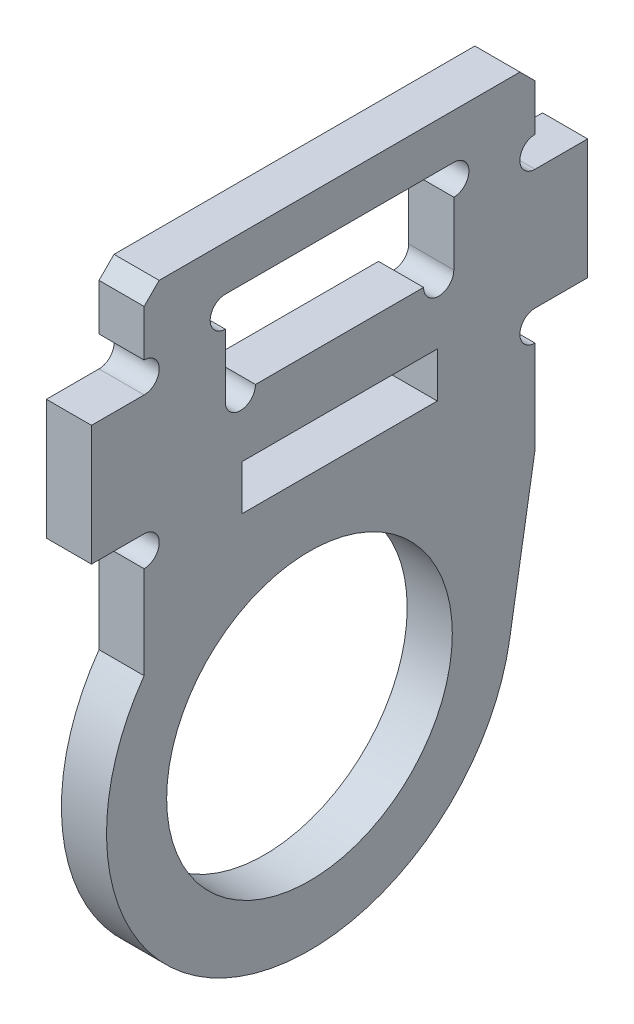
ISO-10303-21;
HEADER;
FILE_DESCRIPTION(('STEP AP214'),'2;1');
FILE_NAME('part.step','',(''),(''),'','','');
FILE_SCHEMA(('AUTOMOTIVE_DESIGN { 1 0 10303 214 1 1 1 1 }'));
ENDSEC;
DATA;
#1=APPLICATION_CONTEXT('core data for automotive mechanical design processes');
#2=APPLICATION_PROTOCOL_DEFINITION('international standard','automotive_design',2000,#1);
#3=PRODUCT_CONTEXT('',#1,'mechanical');
#4=PRODUCT('Part','Part','',(#3));
#5=PRODUCT_RELATED_PRODUCT_CATEGORY('part','',(#4));
#6=PRODUCT_DEFINITION_FORMATION('','',#4);
#7=PRODUCT_DEFINITION_CONTEXT('part definition',#1,'design');
#8=PRODUCT_DEFINITION('design','',#6,#7);
#9=PRODUCT_DEFINITION_SHAPE('','',#8);
#10=(LENGTH_UNIT() NAMED_UNIT(*) SI_UNIT(.MILLI.,.METRE.));
#11=(NAMED_UNIT(*) PLANE_ANGLE_UNIT() SI_UNIT($,.RADIAN.));
#12=(NAMED_UNIT(*) SI_UNIT($,.STERADIAN.) SOLID_ANGLE_UNIT());
#13=UNCERTAINTY_MEASURE_WITH_UNIT(LENGTH_MEASURE(1.E-05),#10,'distance_accuracy_value','');
#14=(GEOMETRIC_REPRESENTATION_CONTEXT(3) GLOBAL_UNCERTAINTY_ASSIGNED_CONTEXT((#13)) GLOBAL_UNIT_ASSIGNED_CONTEXT((#10,
#11,#12)) REPRESENTATION_CONTEXT('',''));
#15=CARTESIAN_POINT('',(0.,0.,0.));
#16=DIRECTION('',(0.,0.,1.));
#17=DIRECTION('',(1.,0.,0.));
#18=AXIS2_PLACEMENT_3D('',#15,#16,#17);
#19=CARTESIAN_POINT('',(3.,0.,13.));
#20=DIRECTION('',(0.,0.,-1.));
#21=DIRECTION('',(-1.,0.,0.));
#22=AXIS2_PLACEMENT_3D('',#19,#20,#21);
#23=PLANE('',#22);
#24=DIRECTION('',(0.,-1.,0.));
#25=VECTOR('',#24,1.);
#26=CARTESIAN_POINT('',(0.,0.,13.));
#27=LINE('',#26,#25);
#28=CARTESIAN_POINT('',(0.,-10.01,13.));
#29=VERTEX_POINT('',#28);
#30=CARTESIAN_POINT('',(0.,-16.1737620787507,13.));
#31=VERTEX_POINT('',#30);
#32=EDGE_CURVE('E424',#29,#31,#27,.T.);
#33=ORIENTED_EDGE('',*,*,#32,.T.);
#34=DIRECTION('',(-1.,0.,0.));
#35=VECTOR('',#34,1.);
#36=CARTESIAN_POINT('',(3.,-16.1737620787507,13.));
#37=LINE('',#36,#35);
#38=CARTESIAN_POINT('',(3.,-16.1737620787507,13.));
#39=VERTEX_POINT('',#38);
#40=EDGE_CURVE('E279',#39,#31,#37,.T.);
#41=ORIENTED_EDGE('',*,*,#40,.F.);
#42=DIRECTION('',(0.,-1.,0.));
#43=VECTOR('',#42,1.);
#44=CARTESIAN_POINT('',(3.,0.,13.));
#45=LINE('',#44,#43);
#46=CARTESIAN_POINT('',(3.,-10.01,13.));
#47=VERTEX_POINT('',#46);
#48=EDGE_CURVE('E489',#47,#39,#45,.T.);
#49=ORIENTED_EDGE('',*,*,#48,.F.);
#50=DIRECTION('',(-1.,0.,0.));
#51=VECTOR('',#50,1.);
#52=CARTESIAN_POINT('',(3.,-10.01,13.));
#53=LINE('',#52,#51);
#54=EDGE_CURVE('E333',#47,#29,#53,.T.);
#55=ORIENTED_EDGE('',*,*,#54,.T.);
#56=EDGE_LOOP('',(#33,#41,#49,#55));
#57=FACE_BOUND('',#56,.T.);
#58=ADVANCED_FACE('F37',(#57),#23,.F.);
#59=CARTESIAN_POINT('',(3.,-24.,2.));
#60=DIRECTION('',(-1.,0.,0.));
#61=DIRECTION('',(0.,0.,1.));
#62=AXIS2_PLACEMENT_3D('',#59,#60,#61);
#63=CYLINDRICAL_SURFACE('',#62,13.5);
#64=CARTESIAN_POINT('',(0.,-24.,2.));
#65=DIRECTION('',(1.,0.,0.));
#66=DIRECTION('',(0.,0.,-1.));
#67=AXIS2_PLACEMENT_3D('',#64,#65,#66);
#68=CIRCLE('',#67,13.5);
#69=CARTESIAN_POINT('',(0.,-26.2315145567071,-11.3142909230347));
#70=VERTEX_POINT('',#69);
#71=EDGE_CURVE('E427',#31,#70,#68,.T.);
#72=ORIENTED_EDGE('',*,*,#71,.T.);
#73=DIRECTION('',(-1.,0.,0.));
#74=VECTOR('',#73,1.);
#75=CARTESIAN_POINT('',(3.,-26.2315145567071,-11.3142909230347));
#76=LINE('',#75,#74);
#77=CARTESIAN_POINT('',(3.,-26.2315145567071,-11.3142909230347));
#78=VERTEX_POINT('',#77);
#79=EDGE_CURVE('E362',#78,#70,#76,.T.);
#80=ORIENTED_EDGE('',*,*,#79,.F.);
#81=CARTESIAN_POINT('',(3.,-24.,2.));
#82=DIRECTION('',(1.,0.,0.));
#83=DIRECTION('',(0.,0.,-1.));
#84=AXIS2_PLACEMENT_3D('',#81,#82,#83);
#85=CIRCLE('',#84,13.5);
#86=EDGE_CURVE('E485',#39,#78,#85,.T.);
#87=ORIENTED_EDGE('',*,*,#86,.F.);
#88=ORIENTED_EDGE('',*,*,#40,.T.);
#89=EDGE_LOOP('',(#72,#80,#87,#88));
#90=FACE_BOUND('',#89,.T.);
#91=ADVANCED_FACE('F484',(#90),#63,.T.);
#92=CARTESIAN_POINT('',(3.,-2.56122487324548,-15.2815015161827));
#93=DIRECTION('',(0.,-0.165297374570894,-0.986243772076645));
#94=DIRECTION('',(0.,0.986243772076645,-0.165297374570894));
#95=AXIS2_PLACEMENT_3D('',#92,#93,#94);
#96=PLANE('',#95);
#97=DIRECTION('',(0.,-0.986243772076645,0.165297374570894));
#98=VECTOR('',#97,1.);
#99=CARTESIAN_POINT('',(0.,-2.56122487324548,-15.2815015161827));
#100=LINE('',#99,#98);
#101=CARTESIAN_POINT('',(0.,-16.1737620787507,-13.));
#102=VERTEX_POINT('',#101);
#103=EDGE_CURVE('E430',#102,#70,#100,.T.);
#104=ORIENTED_EDGE('',*,*,#103,.F.);
#105=DIRECTION('',(-1.,0.,0.));
#106=VECTOR('',#105,1.);
#107=CARTESIAN_POINT('',(3.,-16.1737620787507,-13.));
#108=LINE('',#107,#106);
#109=CARTESIAN_POINT('',(3.,-16.1737620787507,-13.));
#110=VERTEX_POINT('',#109);
#111=EDGE_CURVE('E360',#110,#102,#108,.T.);
#112=ORIENTED_EDGE('',*,*,#111,.F.);
#113=DIRECTION('',(0.,-0.986243772076645,0.165297374570894));
#114=VECTOR('',#113,1.);
#115=CARTESIAN_POINT('',(3.,-2.56122487324548,-15.2815015161827));
#116=LINE('',#115,#114);
#117=EDGE_CURVE('E829',#110,#78,#116,.T.);
#118=ORIENTED_EDGE('',*,*,#117,.T.);
#119=ORIENTED_EDGE('',*,*,#79,.T.);
#120=EDGE_LOOP('',(#104,#112,#118,#119));
#121=FACE_BOUND('',#120,.T.);
#122=ADVANCED_FACE('F478',(#121),#96,.T.);
#123=CARTESIAN_POINT('',(3.,0.,-13.));
#124=DIRECTION('',(0.,0.,-1.));
#125=DIRECTION('',(-1.,0.,0.));
#126=AXIS2_PLACEMENT_3D('',#123,#124,#125);
#127=PLANE('',#126);
#128=DIRECTION('',(0.,-1.,0.));
#129=VECTOR('',#128,1.);
#130=CARTESIAN_POINT('',(0.,0.,-13.));
#131=LINE('',#130,#129);
#132=CARTESIAN_POINT('',(0.,-10.01,-13.));
#133=VERTEX_POINT('',#132);
#134=EDGE_CURVE('E433',#133,#102,#131,.T.);
#135=ORIENTED_EDGE('',*,*,#134,.F.);
#136=DIRECTION('',(-1.,0.,0.));
#137=VECTOR('',#136,1.);
#138=CARTESIAN_POINT('',(3.,-10.01,-13.));
#139=LINE('',#138,#137);
#140=CARTESIAN_POINT('',(3.,-10.01,-13.));
#141=VERTEX_POINT('',#140);
#142=EDGE_CURVE('E358',#141,#133,#139,.T.);
#143=ORIENTED_EDGE('',*,*,#142,.F.);
#144=DIRECTION('',(0.,-1.,0.));
#145=VECTOR('',#144,1.);
#146=CARTESIAN_POINT('',(3.,0.,-13.));
#147=LINE('',#146,#145);
#148=EDGE_CURVE('E474',#141,#110,#147,.T.);
#149=ORIENTED_EDGE('',*,*,#148,.T.);
#150=ORIENTED_EDGE('',*,*,#111,.T.);
#151=EDGE_LOOP('',(#135,#143,#149,#150));
#152=FACE_BOUND('',#151,.T.);
#153=ADVANCED_FACE('F472',(#152),#127,.T.);
#154=CARTESIAN_POINT('',(3.,-9.005,-13.));
#155=DIRECTION('',(-1.,0.,0.));
#156=DIRECTION('',(0.,0.,1.));
#157=AXIS2_PLACEMENT_3D('',#154,#155,#156);
#158=CYLINDRICAL_SURFACE('',#157,1.005);
#159=CARTESIAN_POINT('',(0.,-9.005,-13.));
#160=DIRECTION('',(1.,0.,0.));
#161=DIRECTION('',(0.,0.,-1.));
#162=AXIS2_PLACEMENT_3D('',#159,#160,#161);
#163=CIRCLE('',#162,1.005);
#164=CARTESIAN_POINT('',(0.,-8.,-13.));
#165=VERTEX_POINT('',#164);
#166=EDGE_CURVE('E436',#165,#133,#163,.T.);
#167=ORIENTED_EDGE('',*,*,#166,.F.);
#168=DIRECTION('',(-1.,0.,0.));
#169=VECTOR('',#168,1.);
#170=CARTESIAN_POINT('',(3.,-8.,-13.));
#171=LINE('',#170,#169);
#172=CARTESIAN_POINT('',(3.,-8.,-13.));
#173=VERTEX_POINT('',#172);
#174=EDGE_CURVE('E356',#173,#165,#171,.T.);
#175=ORIENTED_EDGE('',*,*,#174,.F.);
#176=CARTESIAN_POINT('',(3.,-9.005,-13.));
#177=DIRECTION('',(1.,0.,0.));
#178=DIRECTION('',(0.,0.,-1.));
#179=AXIS2_PLACEMENT_3D('',#176,#177,#178);
#180=CIRCLE('',#179,1.005);
#181=EDGE_CURVE('E468',#173,#141,#180,.T.);
#182=ORIENTED_EDGE('',*,*,#181,.T.);
#183=ORIENTED_EDGE('',*,*,#142,.T.);
#184=EDGE_LOOP('',(#167,#175,#182,#183));
#185=FACE_BOUND('',#184,.T.);
#186=ADVANCED_FACE('F465',(#185),#158,.F.);
#187=CARTESIAN_POINT('',(3.,-8.00000000000001,0.));
#188=DIRECTION('',(0.,-1.,0.));
#189=DIRECTION('',(0.,0.,-1.));
#190=AXIS2_PLACEMENT_3D('',#187,#188,#189);
#191=PLANE('',#190);
#192=DIRECTION('',(0.,0.,1.));
#193=VECTOR('',#192,1.);
#194=CARTESIAN_POINT('',(0.,-8.00000000000001,0.));
#195=LINE('',#194,#193);
#196=CARTESIAN_POINT('',(0.,-8.,-16.5));
#197=VERTEX_POINT('',#196);
#198=EDGE_CURVE('E439',#197,#165,#195,.T.);
#199=ORIENTED_EDGE('',*,*,#198,.F.);
#200=DIRECTION('',(-1.,0.,0.));
#201=VECTOR('',#200,1.);
#202=CARTESIAN_POINT('',(3.,-8.,-16.5));
#203=LINE('',#202,#201);
#204=CARTESIAN_POINT('',(3.,-8.,-16.5));
#205=VERTEX_POINT('',#204);
#206=EDGE_CURVE('E354',#205,#197,#203,.T.);
#207=ORIENTED_EDGE('',*,*,#206,.F.);
#208=DIRECTION('',(0.,0.,1.));
#209=VECTOR('',#208,1.);
#210=CARTESIAN_POINT('',(3.,-8.00000000000001,0.));
#211=LINE('',#210,#209);
#212=EDGE_CURVE('E838',#205,#173,#211,.T.);
#213=ORIENTED_EDGE('',*,*,#212,.T.);
#214=ORIENTED_EDGE('',*,*,#174,.T.);
#215=EDGE_LOOP('',(#199,#207,#213,#214));
#216=FACE_BOUND('',#215,.T.);
#217=ADVANCED_FACE('F461',(#216),#191,.T.);
#218=CARTESIAN_POINT('',(3.,0.,-16.5));
#219=DIRECTION('',(0.,0.,-1.));
#220=DIRECTION('',(-1.,0.,0.));
#221=AXIS2_PLACEMENT_3D('',#218,#219,#220);
#222=PLANE('',#221);
#223=DIRECTION('',(0.,-1.,0.));
#224=VECTOR('',#223,1.);
#225=CARTESIAN_POINT('',(0.,0.,-16.5));
#226=LINE('',#225,#224);
#227=CARTESIAN_POINT('',(0.,0.,-16.5));
#228=VERTEX_POINT('',#227);
#229=EDGE_CURVE('E442',#228,#197,#226,.T.);
#230=ORIENTED_EDGE('',*,*,#229,.F.);
#231=DIRECTION('',(-1.,0.,0.));
#232=VECTOR('',#231,1.);
#233=CARTESIAN_POINT('',(3.,0.,-16.5));
#234=LINE('',#233,#232);
#235=CARTESIAN_POINT('',(3.,0.,-16.5));
#236=VERTEX_POINT('',#235);
#237=EDGE_CURVE('E352',#236,#228,#234,.T.);
#238=ORIENTED_EDGE('',*,*,#237,.F.);
#239=DIRECTION('',(0.,-1.,0.));
#240=VECTOR('',#239,1.);
#241=CARTESIAN_POINT('',(3.,0.,-16.5));
#242=LINE('',#241,#240);
#243=EDGE_CURVE('E457',#236,#205,#242,.T.);
#244=ORIENTED_EDGE('',*,*,#243,.T.);
#245=ORIENTED_EDGE('',*,*,#206,.T.);
#246=EDGE_LOOP('',(#230,#238,#244,#245));
#247=FACE_BOUND('',#246,.T.);
#248=ADVANCED_FACE('F455',(#247),#222,.T.);
#249=CARTESIAN_POINT('',(3.,0.,0.));
#250=DIRECTION('',(0.,1.,0.));
#251=DIRECTION('',(0.,0.,1.));
#252=AXIS2_PLACEMENT_3D('',#249,#250,#251);
#253=PLANE('',#252);
#254=DIRECTION('',(0.,0.,-1.));
#255=VECTOR('',#254,1.);
#256=CARTESIAN_POINT('',(0.,0.,0.));
#257=LINE('',#256,#255);
#258=CARTESIAN_POINT('',(0.,0.,-13.));
#259=VERTEX_POINT('',#258);
#260=EDGE_CURVE('E316',#259,#228,#257,.T.);
#261=ORIENTED_EDGE('',*,*,#260,.F.);
#262=DIRECTION('',(-1.,0.,0.));
#263=VECTOR('',#262,1.);
#264=CARTESIAN_POINT('',(3.,0.,-13.));
#265=LINE('',#264,#263);
#266=CARTESIAN_POINT('',(3.,0.,-13.));
#267=VERTEX_POINT('',#266);
#268=EDGE_CURVE('E350',#267,#259,#265,.T.);
#269=ORIENTED_EDGE('',*,*,#268,.F.);
#270=DIRECTION('',(0.,0.,-1.));
#271=VECTOR('',#270,1.);
#272=CARTESIAN_POINT('',(3.,0.,0.));
#273=LINE('',#272,#271);
#274=EDGE_CURVE('E451',#267,#236,#273,.T.);
#275=ORIENTED_EDGE('',*,*,#274,.T.);
#276=ORIENTED_EDGE('',*,*,#237,.T.);
#277=EDGE_LOOP('',(#261,#269,#275,#276));
#278=FACE_BOUND('',#277,.T.);
#279=ADVANCED_FACE('F448',(#278),#253,.T.);
#280=CARTESIAN_POINT('',(3.,1.005,-13.));
#281=DIRECTION('',(-1.,0.,0.));
#282=DIRECTION('',(0.,0.,1.));
#283=AXIS2_PLACEMENT_3D('',#280,#281,#282);
#284=CYLINDRICAL_SURFACE('',#283,1.005);
#285=CARTESIAN_POINT('',(0.,1.005,-13.));
#286=DIRECTION('',(1.,0.,0.));
#287=DIRECTION('',(0.,0.,-1.));
#288=AXIS2_PLACEMENT_3D('',#285,#286,#287);
#289=CIRCLE('',#288,1.005);
#290=CARTESIAN_POINT('',(0.,2.01,-13.));
#291=VERTEX_POINT('',#290);
#292=EDGE_CURVE('E312',#291,#259,#289,.T.);
#293=ORIENTED_EDGE('',*,*,#292,.F.);
#294=DIRECTION('',(-1.,0.,0.));
#295=VECTOR('',#294,1.);
#296=CARTESIAN_POINT('',(3.,2.01,-13.));
#297=LINE('',#296,#295);
#298=CARTESIAN_POINT('',(3.,2.01,-13.));
#299=VERTEX_POINT('',#298);
#300=EDGE_CURVE('E310',#299,#291,#297,.T.);
#301=ORIENTED_EDGE('',*,*,#300,.F.);
#302=CARTESIAN_POINT('',(3.,1.005,-13.));
#303=DIRECTION('',(1.,0.,0.));
#304=DIRECTION('',(0.,0.,-1.));
#305=AXIS2_PLACEMENT_3D('',#302,#303,#304);
#306=CIRCLE('',#305,1.005);
#307=EDGE_CURVE('E815',#299,#267,#306,.T.);
#308=ORIENTED_EDGE('',*,*,#307,.T.);
#309=ORIENTED_EDGE('',*,*,#268,.T.);
#310=EDGE_LOOP('',(#293,#301,#308,#309));
#311=FACE_BOUND('',#310,.T.);
#312=ADVANCED_FACE('F734',(#311),#284,.F.);
#313=CARTESIAN_POINT('',(3.,0.,-13.));
#314=DIRECTION('',(0.,0.,-1.));
#315=DIRECTION('',(-1.,0.,0.));
#316=AXIS2_PLACEMENT_3D('',#313,#314,#315);
#317=PLANE('',#316);
#318=DIRECTION('',(0.,-1.,0.));
#319=VECTOR('',#318,1.);
#320=CARTESIAN_POINT('',(0.,0.,-13.));
#321=LINE('',#320,#319);
#322=CARTESIAN_POINT('',(0.,5.1,-13.));
#323=VERTEX_POINT('',#322);
#324=EDGE_CURVE('E305',#323,#291,#321,.T.);
#325=ORIENTED_EDGE('',*,*,#324,.F.);
#326=DIRECTION('',(1.,0.,0.));
#327=VECTOR('',#326,1.);
#328=CARTESIAN_POINT('',(3.,5.1,-13.));
#329=LINE('',#328,#327);
#330=CARTESIAN_POINT('',(3.,5.1,-13.));
#331=VERTEX_POINT('',#330);
#332=EDGE_CURVE('E60',#323,#331,#329,.T.);
#333=ORIENTED_EDGE('',*,*,#332,.T.);
#334=DIRECTION('',(0.,-1.,0.));
#335=VECTOR('',#334,1.);
#336=CARTESIAN_POINT('',(3.,0.,-13.));
#337=LINE('',#336,#335);
#338=EDGE_CURVE('E291',#331,#299,#337,.T.);
#339=ORIENTED_EDGE('',*,*,#338,.T.);
#340=ORIENTED_EDGE('',*,*,#300,.T.);
#341=EDGE_LOOP('',(#325,#333,#339,#340));
#342=FACE_BOUND('',#341,.T.);
#343=ADVANCED_FACE('F308',(#342),#317,.T.);
#344=CARTESIAN_POINT('',(3.,6.1,0.));
#345=DIRECTION('',(0.,1.,0.));
#346=DIRECTION('',(0.,0.,1.));
#347=AXIS2_PLACEMENT_3D('',#344,#345,#346);
#348=PLANE('',#347);
#349=DIRECTION('',(0.,0.,-1.));
#350=VECTOR('',#349,1.);
#351=CARTESIAN_POINT('',(3.,6.1,0.));
#352=LINE('',#351,#350);
#353=CARTESIAN_POINT('',(3.,6.1,12.));
#354=VERTEX_POINT('',#353);
#355=CARTESIAN_POINT('',(3.,6.1,-12.));
#356=VERTEX_POINT('',#355);
#357=EDGE_CURVE('E289',#354,#356,#352,.T.);
#358=ORIENTED_EDGE('',*,*,#357,.T.);
#359=DIRECTION('',(-1.,0.,0.));
#360=VECTOR('',#359,1.);
#361=CARTESIAN_POINT('',(3.,6.1,-12.));
#362=LINE('',#361,#360);
#363=CARTESIAN_POINT('',(0.,6.1,-12.));
#364=VERTEX_POINT('',#363);
#365=EDGE_CURVE('E278',#356,#364,#362,.T.);
#366=ORIENTED_EDGE('',*,*,#365,.T.);
#367=DIRECTION('',(0.,0.,-1.));
#368=VECTOR('',#367,1.);
#369=CARTESIAN_POINT('',(0.,6.1,0.));
#370=LINE('',#369,#368);
#371=CARTESIAN_POINT('',(0.,6.1,12.));
#372=VERTEX_POINT('',#371);
#373=EDGE_CURVE('E307',#372,#364,#370,.T.);
#374=ORIENTED_EDGE('',*,*,#373,.F.);
#375=DIRECTION('',(1.,0.,0.));
#376=VECTOR('',#375,1.);
#377=CARTESIAN_POINT('',(3.,6.1,12.));
#378=LINE('',#377,#376);
#379=EDGE_CURVE('E276',#372,#354,#378,.T.);
#380=ORIENTED_EDGE('',*,*,#379,.T.);
#381=EDGE_LOOP('',(#358,#366,#374,#380));
#382=FACE_BOUND('',#381,.T.);
#383=ADVANCED_FACE('F295',(#382),#348,.T.);
#384=CARTESIAN_POINT('',(3.,0.,13.));
#385=DIRECTION('',(0.,0.,-1.));
#386=DIRECTION('',(-1.,0.,0.));
#387=AXIS2_PLACEMENT_3D('',#384,#385,#386);
#388=PLANE('',#387);
#389=DIRECTION('',(0.,-1.,0.));
#390=VECTOR('',#389,1.);
#391=CARTESIAN_POINT('',(3.,0.,13.));
#392=LINE('',#391,#390);
#393=CARTESIAN_POINT('',(3.,5.1,13.));
#394=VERTEX_POINT('',#393);
#395=CARTESIAN_POINT('',(3.,2.01,13.));
#396=VERTEX_POINT('',#395);
#397=EDGE_CURVE('E299',#394,#396,#392,.T.);
#398=ORIENTED_EDGE('',*,*,#397,.F.);
#399=DIRECTION('',(-1.,0.,0.));
#400=VECTOR('',#399,1.);
#401=CARTESIAN_POINT('',(0.,5.1,13.));
#402=LINE('',#401,#400);
#403=CARTESIAN_POINT('',(0.,5.1,13.));
#404=VERTEX_POINT('',#403);
#405=EDGE_CURVE('E11',#394,#404,#402,.T.);
#406=ORIENTED_EDGE('',*,*,#405,.T.);
#407=DIRECTION('',(0.,-1.,0.));
#408=VECTOR('',#407,1.);
#409=CARTESIAN_POINT('',(0.,0.,13.));
#410=LINE('',#409,#408);
#411=CARTESIAN_POINT('',(0.,2.01,13.));
#412=VERTEX_POINT('',#411);
#413=EDGE_CURVE('E314',#404,#412,#410,.T.);
#414=ORIENTED_EDGE('',*,*,#413,.T.);
#415=DIRECTION('',(-1.,0.,0.));
#416=VECTOR('',#415,1.);
#417=CARTESIAN_POINT('',(3.,2.01,13.));
#418=LINE('',#417,#416);
#419=EDGE_CURVE('E346',#396,#412,#418,.T.);
#420=ORIENTED_EDGE('',*,*,#419,.F.);
#421=EDGE_LOOP('',(#398,#406,#414,#420));
#422=FACE_BOUND('',#421,.T.);
#423=ADVANCED_FACE('F521',(#422),#388,.F.);
#424=CARTESIAN_POINT('',(3.,1.005,13.));
#425=DIRECTION('',(-1.,0.,0.));
#426=DIRECTION('',(0.,0.,1.));
#427=AXIS2_PLACEMENT_3D('',#424,#425,#426);
#428=CYLINDRICAL_SURFACE('',#427,1.005);
#429=CARTESIAN_POINT('',(0.,1.005,13.));
#430=DIRECTION('',(1.,0.,0.));
#431=DIRECTION('',(0.,0.,-1.));
#432=AXIS2_PLACEMENT_3D('',#429,#430,#431);
#433=CIRCLE('',#432,1.005);
#434=CARTESIAN_POINT('',(0.,0.,13.));
#435=VERTEX_POINT('',#434);
#436=EDGE_CURVE('E321',#435,#412,#433,.T.);
#437=ORIENTED_EDGE('',*,*,#436,.F.);
#438=DIRECTION('',(-1.,0.,0.));
#439=VECTOR('',#438,1.);
#440=CARTESIAN_POINT('',(3.,0.,13.));
#441=LINE('',#440,#439);
#442=CARTESIAN_POINT('',(3.,0.,13.));
#443=VERTEX_POINT('',#442);
#444=EDGE_CURVE('E344',#443,#435,#441,.T.);
#445=ORIENTED_EDGE('',*,*,#444,.F.);
#446=CARTESIAN_POINT('',(3.,1.005,13.));
#447=DIRECTION('',(1.,0.,0.));
#448=DIRECTION('',(0.,0.,-1.));
#449=AXIS2_PLACEMENT_3D('',#446,#447,#448);
#450=CIRCLE('',#449,1.005);
#451=EDGE_CURVE('E519',#443,#396,#450,.T.);
#452=ORIENTED_EDGE('',*,*,#451,.T.);
#453=ORIENTED_EDGE('',*,*,#419,.T.);
#454=EDGE_LOOP('',(#437,#445,#452,#453));
#455=FACE_BOUND('',#454,.T.);
#456=ADVANCED_FACE('F516',(#455),#428,.F.);
#457=CARTESIAN_POINT('',(3.,0.,0.));
#458=DIRECTION('',(0.,-1.,0.));
#459=DIRECTION('',(0.,0.,-1.));
#460=AXIS2_PLACEMENT_3D('',#457,#458,#459);
#461=PLANE('',#460);
#462=DIRECTION('',(0.,0.,1.));
#463=VECTOR('',#462,1.);
#464=CARTESIAN_POINT('',(0.,0.,0.));
#465=LINE('',#464,#463);
#466=CARTESIAN_POINT('',(0.,0.,16.5));
#467=VERTEX_POINT('',#466);
#468=EDGE_CURVE('E324',#435,#467,#465,.T.);
#469=ORIENTED_EDGE('',*,*,#468,.T.);
#470=DIRECTION('',(-1.,0.,0.));
#471=VECTOR('',#470,1.);
#472=CARTESIAN_POINT('',(3.,0.,16.5));
#473=LINE('',#472,#471);
#474=CARTESIAN_POINT('',(3.,0.,16.5));
#475=VERTEX_POINT('',#474);
#476=EDGE_CURVE('E341',#475,#467,#473,.T.);
#477=ORIENTED_EDGE('',*,*,#476,.F.);
#478=DIRECTION('',(0.,0.,1.));
#479=VECTOR('',#478,1.);
#480=CARTESIAN_POINT('',(3.,0.,0.));
#481=LINE('',#480,#479);
#482=EDGE_CURVE('E511',#443,#475,#481,.T.);
#483=ORIENTED_EDGE('',*,*,#482,.F.);
#484=ORIENTED_EDGE('',*,*,#444,.T.);
#485=EDGE_LOOP('',(#469,#477,#483,#484));
#486=FACE_BOUND('',#485,.T.);
#487=ADVANCED_FACE('F510',(#486),#461,.F.);
#488=CARTESIAN_POINT('',(3.,0.,16.5));
#489=DIRECTION('',(0.,0.,-1.));
#490=DIRECTION('',(-1.,0.,0.));
#491=AXIS2_PLACEMENT_3D('',#488,#489,#490);
#492=PLANE('',#491);
#493=DIRECTION('',(0.,-1.,0.));
#494=VECTOR('',#493,1.);
#495=CARTESIAN_POINT('',(0.,0.,16.5));
#496=LINE('',#495,#494);
#497=CARTESIAN_POINT('',(0.,-8.,16.5));
#498=VERTEX_POINT('',#497);
#499=EDGE_CURVE('E326',#467,#498,#496,.T.);
#500=ORIENTED_EDGE('',*,*,#499,.T.);
#501=DIRECTION('',(-1.,0.,0.));
#502=VECTOR('',#501,1.);
#503=CARTESIAN_POINT('',(3.,-8.,16.5));
#504=LINE('',#503,#502);
#505=CARTESIAN_POINT('',(3.,-8.,16.5));
#506=VERTEX_POINT('',#505);
#507=EDGE_CURVE('E338',#506,#498,#504,.T.);
#508=ORIENTED_EDGE('',*,*,#507,.F.);
#509=DIRECTION('',(0.,-1.,0.));
#510=VECTOR('',#509,1.);
#511=CARTESIAN_POINT('',(3.,0.,16.5));
#512=LINE('',#511,#510);
#513=EDGE_CURVE('E506',#475,#506,#512,.T.);
#514=ORIENTED_EDGE('',*,*,#513,.F.);
#515=ORIENTED_EDGE('',*,*,#476,.T.);
#516=EDGE_LOOP('',(#500,#508,#514,#515));
#517=FACE_BOUND('',#516,.T.);
#518=ADVANCED_FACE('F505',(#517),#492,.F.);
#519=CARTESIAN_POINT('',(3.,-8.00000000000002,0.));
#520=DIRECTION('',(0.,1.,0.));
#521=DIRECTION('',(0.,0.,1.));
#522=AXIS2_PLACEMENT_3D('',#519,#520,#521);
#523=PLANE('',#522);
#524=DIRECTION('',(0.,0.,-1.));
#525=VECTOR('',#524,1.);
#526=CARTESIAN_POINT('',(0.,-8.00000000000002,0.));
#527=LINE('',#526,#525);
#528=CARTESIAN_POINT('',(0.,-8.00000000000001,13.));
#529=VERTEX_POINT('',#528);
#530=EDGE_CURVE('E328',#498,#529,#527,.T.);
#531=ORIENTED_EDGE('',*,*,#530,.T.);
#532=DIRECTION('',(-1.,0.,0.));
#533=VECTOR('',#532,1.);
#534=CARTESIAN_POINT('',(3.,-8.00000000000001,13.));
#535=LINE('',#534,#533);
#536=CARTESIAN_POINT('',(3.,-8.00000000000001,13.));
#537=VERTEX_POINT('',#536);
#538=EDGE_CURVE('E335',#537,#529,#535,.T.);
#539=ORIENTED_EDGE('',*,*,#538,.F.);
#540=DIRECTION('',(0.,0.,-1.));
#541=VECTOR('',#540,1.);
#542=CARTESIAN_POINT('',(3.,-8.00000000000002,0.));
#543=LINE('',#542,#541);
#544=EDGE_CURVE('E502',#506,#537,#543,.T.);
#545=ORIENTED_EDGE('',*,*,#544,.F.);
#546=ORIENTED_EDGE('',*,*,#507,.T.);
#547=EDGE_LOOP('',(#531,#539,#545,#546));
#548=FACE_BOUND('',#547,.T.);
#549=ADVANCED_FACE('F499',(#548),#523,.F.);
#550=CARTESIAN_POINT('',(3.,2.095,7.6));
#551=DIRECTION('',(-1.,0.,0.));
#552=DIRECTION('',(0.,0.,1.));
#553=AXIS2_PLACEMENT_3D('',#550,#551,#552);
#554=CYLINDRICAL_SURFACE('',#553,1.005);
#555=CARTESIAN_POINT('',(0.,2.095,7.6));
#556=DIRECTION('',(1.,0.,0.));
#557=DIRECTION('',(0.,0.,-1.));
#558=AXIS2_PLACEMENT_3D('',#555,#556,#557);
#559=CIRCLE('',#558,1.005);
#560=CARTESIAN_POINT('',(0.,3.1,7.6));
#561=VERTEX_POINT('',#560);
#562=CARTESIAN_POINT('',(0.,1.09,7.6));
#563=VERTEX_POINT('',#562);
#564=EDGE_CURVE('E397',#561,#563,#559,.T.);
#565=ORIENTED_EDGE('',*,*,#564,.F.);
#566=DIRECTION('',(-1.,0.,0.));
#567=VECTOR('',#566,1.);
#568=CARTESIAN_POINT('',(3.,3.1,7.6));
#569=LINE('',#568,#567);
#570=CARTESIAN_POINT('',(3.,3.1,7.6));
#571=VERTEX_POINT('',#570);
#572=EDGE_CURVE('E336',#571,#561,#569,.T.);
#573=ORIENTED_EDGE('',*,*,#572,.F.);
#574=CARTESIAN_POINT('',(3.,2.095,7.6));
#575=DIRECTION('',(1.,0.,0.));
#576=DIRECTION('',(0.,0.,-1.));
#577=AXIS2_PLACEMENT_3D('',#574,#575,#576);
#578=CIRCLE('',#577,1.005);
#579=CARTESIAN_POINT('',(3.,1.09,7.6));
#580=VERTEX_POINT('',#579);
#581=EDGE_CURVE('E855',#571,#580,#578,.T.);
#582=ORIENTED_EDGE('',*,*,#581,.T.);
#583=DIRECTION('',(-1.,0.,0.));
#584=VECTOR('',#583,1.);
#585=CARTESIAN_POINT('',(3.,1.09,7.6));
#586=LINE('',#585,#584);
#587=EDGE_CURVE('E268',#580,#563,#586,.T.);
#588=ORIENTED_EDGE('',*,*,#587,.T.);
#589=EDGE_LOOP('',(#565,#573,#582,#588));
#590=FACE_BOUND('',#589,.T.);
#591=ADVANCED_FACE('F564',(#590),#554,.F.);
#592=CARTESIAN_POINT('',(3.,3.1,0.));
#593=DIRECTION('',(0.,-1.,0.));
#594=DIRECTION('',(0.,0.,-1.));
#595=AXIS2_PLACEMENT_3D('',#592,#593,#594);
#596=PLANE('',#595);
#597=DIRECTION('',(0.,0.,1.));
#598=VECTOR('',#597,1.);
#599=CARTESIAN_POINT('',(0.,3.1,0.));
#600=LINE('',#599,#598);
#601=CARTESIAN_POINT('',(0.,3.1,-7.6));
#602=VERTEX_POINT('',#601);
#603=EDGE_CURVE('E403',#602,#561,#600,.T.);
#604=ORIENTED_EDGE('',*,*,#603,.F.);
#605=DIRECTION('',(-1.,0.,0.));
#606=VECTOR('',#605,1.);
#607=CARTESIAN_POINT('',(3.,3.1,-7.6));
#608=LINE('',#607,#606);
#609=CARTESIAN_POINT('',(3.,3.1,-7.6));
#610=VERTEX_POINT('',#609);
#611=EDGE_CURVE('E375',#610,#602,#608,.T.);
#612=ORIENTED_EDGE('',*,*,#611,.F.);
#613=DIRECTION('',(0.,0.,1.));
#614=VECTOR('',#613,1.);
#615=CARTESIAN_POINT('',(3.,3.1,0.));
#616=LINE('',#615,#614);
#617=EDGE_CURVE('E852',#610,#571,#616,.T.);
#618=ORIENTED_EDGE('',*,*,#617,.T.);
#619=ORIENTED_EDGE('',*,*,#572,.T.);
#620=EDGE_LOOP('',(#604,#612,#618,#619));
#621=FACE_BOUND('',#620,.T.);
#622=ADVANCED_FACE('F560',(#621),#596,.T.);
#623=CARTESIAN_POINT('',(3.,2.095,-7.6));
#624=DIRECTION('',(-1.,0.,0.));
#625=DIRECTION('',(0.,0.,1.));
#626=AXIS2_PLACEMENT_3D('',#623,#624,#625);
#627=CYLINDRICAL_SURFACE('',#626,1.005);
#628=CARTESIAN_POINT('',(0.,2.095,-7.6));
#629=DIRECTION('',(1.,0.,0.));
#630=DIRECTION('',(0.,0.,-1.));
#631=AXIS2_PLACEMENT_3D('',#628,#629,#630);
#632=CIRCLE('',#631,1.005);
#633=CARTESIAN_POINT('',(0.,1.09,-7.6));
#634=VERTEX_POINT('',#633);
#635=EDGE_CURVE('E406',#634,#602,#632,.T.);
#636=ORIENTED_EDGE('',*,*,#635,.F.);
#637=DIRECTION('',(-1.,0.,0.));
#638=VECTOR('',#637,1.);
#639=CARTESIAN_POINT('',(3.,1.09,-7.6));
#640=LINE('',#639,#638);
#641=CARTESIAN_POINT('',(3.,1.09,-7.6));
#642=VERTEX_POINT('',#641);
#643=EDGE_CURVE('E373',#642,#634,#640,.T.);
#644=ORIENTED_EDGE('',*,*,#643,.F.);
#645=CARTESIAN_POINT('',(3.,2.095,-7.6));
#646=DIRECTION('',(1.,0.,0.));
#647=DIRECTION('',(0.,0.,-1.));
#648=AXIS2_PLACEMENT_3D('',#645,#646,#647);
#649=CIRCLE('',#648,1.005);
#650=EDGE_CURVE('E849',#642,#610,#649,.T.);
#651=ORIENTED_EDGE('',*,*,#650,.T.);
#652=ORIENTED_EDGE('',*,*,#611,.T.);
#653=EDGE_LOOP('',(#636,#644,#651,#652));
#654=FACE_BOUND('',#653,.T.);
#655=ADVANCED_FACE('F556',(#654),#627,.F.);
#656=CARTESIAN_POINT('',(3.,0.,-7.6));
#657=DIRECTION('',(0.,0.,1.));
#658=DIRECTION('',(1.,0.,0.));
#659=AXIS2_PLACEMENT_3D('',#656,#657,#658);
#660=PLANE('',#659);
#661=DIRECTION('',(0.,1.,0.));
#662=VECTOR('',#661,1.);
#663=CARTESIAN_POINT('',(0.,0.,-7.6));
#664=LINE('',#663,#662);
#665=CARTESIAN_POINT('',(0.,-3.1,-7.6));
#666=VERTEX_POINT('',#665);
#667=EDGE_CURVE('E409',#666,#634,#664,.T.);
#668=ORIENTED_EDGE('',*,*,#667,.F.);
#669=DIRECTION('',(-1.,0.,0.));
#670=VECTOR('',#669,1.);
#671=CARTESIAN_POINT('',(3.,-3.1,-7.6));
#672=LINE('',#671,#670);
#673=CARTESIAN_POINT('',(3.,-3.1,-7.6));
#674=VERTEX_POINT('',#673);
#675=EDGE_CURVE('E371',#674,#666,#672,.T.);
#676=ORIENTED_EDGE('',*,*,#675,.F.);
#677=DIRECTION('',(0.,1.,0.));
#678=VECTOR('',#677,1.);
#679=CARTESIAN_POINT('',(3.,0.,-7.6));
#680=LINE('',#679,#678);
#681=EDGE_CURVE('E846',#674,#642,#680,.T.);
#682=ORIENTED_EDGE('',*,*,#681,.T.);
#683=ORIENTED_EDGE('',*,*,#643,.T.);
#684=EDGE_LOOP('',(#668,#676,#682,#683));
#685=FACE_BOUND('',#684,.T.);
#686=ADVANCED_FACE('F552',(#685),#660,.T.);
#687=CARTESIAN_POINT('',(3.,-3.1,-6.595));
#688=DIRECTION('',(-1.,0.,0.));
#689=DIRECTION('',(0.,0.,1.));
#690=AXIS2_PLACEMENT_3D('',#687,#688,#689);
#691=CYLINDRICAL_SURFACE('',#690,1.005);
#692=CARTESIAN_POINT('',(0.,-3.1,-6.595));
#693=DIRECTION('',(1.,0.,0.));
#694=DIRECTION('',(0.,0.,-1.));
#695=AXIS2_PLACEMENT_3D('',#692,#693,#694);
#696=CIRCLE('',#695,1.005);
#697=CARTESIAN_POINT('',(0.,-3.1,-5.59));
#698=VERTEX_POINT('',#697);
#699=EDGE_CURVE('E412',#698,#666,#696,.T.);
#700=ORIENTED_EDGE('',*,*,#699,.F.);
#701=DIRECTION('',(-1.,0.,0.));
#702=VECTOR('',#701,1.);
#703=CARTESIAN_POINT('',(3.,-3.1,-5.59));
#704=LINE('',#703,#702);
#705=CARTESIAN_POINT('',(3.,-3.1,-5.59));
#706=VERTEX_POINT('',#705);
#707=EDGE_CURVE('E369',#706,#698,#704,.T.);
#708=ORIENTED_EDGE('',*,*,#707,.F.);
#709=CARTESIAN_POINT('',(3.,-3.1,-6.595));
#710=DIRECTION('',(1.,0.,0.));
#711=DIRECTION('',(0.,0.,-1.));
#712=AXIS2_PLACEMENT_3D('',#709,#710,#711);
#713=CIRCLE('',#712,1.005);
#714=EDGE_CURVE('E843',#706,#674,#713,.T.);
#715=ORIENTED_EDGE('',*,*,#714,.T.);
#716=ORIENTED_EDGE('',*,*,#675,.T.);
#717=EDGE_LOOP('',(#700,#708,#715,#716));
#718=FACE_BOUND('',#717,.T.);
#719=ADVANCED_FACE('F548',(#718),#691,.F.);
#720=CARTESIAN_POINT('',(3.,-3.1,0.));
#721=DIRECTION('',(0.,-1.,0.));
#722=DIRECTION('',(0.,0.,-1.));
#723=AXIS2_PLACEMENT_3D('',#720,#721,#722);
#724=PLANE('',#723);
#725=DIRECTION('',(0.,0.,1.));
#726=VECTOR('',#725,1.);
#727=CARTESIAN_POINT('',(0.,-3.1,0.));
#728=LINE('',#727,#726);
#729=CARTESIAN_POINT('',(0.,-3.1,5.59));
#730=VERTEX_POINT('',#729);
#731=EDGE_CURVE('E415',#698,#730,#728,.T.);
#732=ORIENTED_EDGE('',*,*,#731,.T.);
#733=DIRECTION('',(-1.,0.,0.));
#734=VECTOR('',#733,1.);
#735=CARTESIAN_POINT('',(3.,-3.1,5.59));
#736=LINE('',#735,#734);
#737=CARTESIAN_POINT('',(3.,-3.1,5.59));
#738=VERTEX_POINT('',#737);
#739=EDGE_CURVE('E367',#738,#730,#736,.T.);
#740=ORIENTED_EDGE('',*,*,#739,.F.);
#741=DIRECTION('',(0.,0.,1.));
#742=VECTOR('',#741,1.);
#743=CARTESIAN_POINT('',(3.,-3.1,0.));
#744=LINE('',#743,#742);
#745=EDGE_CURVE('E841',#706,#738,#744,.T.);
#746=ORIENTED_EDGE('',*,*,#745,.F.);
#747=ORIENTED_EDGE('',*,*,#707,.T.);
#748=EDGE_LOOP('',(#732,#740,#746,#747));
#749=FACE_BOUND('',#748,.T.);
#750=ADVANCED_FACE('F544',(#749),#724,.F.);
#751=CARTESIAN_POINT('',(3.,-3.1,6.595));
#752=DIRECTION('',(-1.,0.,0.));
#753=DIRECTION('',(0.,0.,1.));
#754=AXIS2_PLACEMENT_3D('',#751,#752,#753);
#755=CYLINDRICAL_SURFACE('',#754,1.005);
#756=CARTESIAN_POINT('',(0.,-3.1,6.595));
#757=DIRECTION('',(1.,0.,0.));
#758=DIRECTION('',(0.,0.,-1.));
#759=AXIS2_PLACEMENT_3D('',#756,#757,#758);
#760=CIRCLE('',#759,1.005);
#761=CARTESIAN_POINT('',(0.,-3.1,7.6));
#762=VERTEX_POINT('',#761);
#763=EDGE_CURVE('E418',#762,#730,#760,.T.);
#764=ORIENTED_EDGE('',*,*,#763,.F.);
#765=DIRECTION('',(-1.,0.,0.));
#766=VECTOR('',#765,1.);
#767=CARTESIAN_POINT('',(3.,-3.1,7.6));
#768=LINE('',#767,#766);
#769=CARTESIAN_POINT('',(3.,-3.1,7.6));
#770=VERTEX_POINT('',#769);
#771=EDGE_CURVE('E270',#770,#762,#768,.T.);
#772=ORIENTED_EDGE('',*,*,#771,.F.);
#773=CARTESIAN_POINT('',(3.,-3.1,6.595));
#774=DIRECTION('',(1.,0.,0.));
#775=DIRECTION('',(0.,0.,-1.));
#776=AXIS2_PLACEMENT_3D('',#773,#774,#775);
#777=CIRCLE('',#776,1.005);
#778=EDGE_CURVE('E831',#770,#738,#777,.T.);
#779=ORIENTED_EDGE('',*,*,#778,.T.);
#780=ORIENTED_EDGE('',*,*,#739,.T.);
#781=EDGE_LOOP('',(#764,#772,#779,#780));
#782=FACE_BOUND('',#781,.T.);
#783=ADVANCED_FACE('F541',(#782),#755,.F.);
#784=CARTESIAN_POINT('',(3.,-10.1,0.));
#785=DIRECTION('',(0.,-1.,0.));
#786=DIRECTION('',(0.,0.,-1.));
#787=AXIS2_PLACEMENT_3D('',#784,#785,#786);
#788=PLANE('',#787);
#789=DIRECTION('',(0.,0.,1.));
#790=VECTOR('',#789,1.);
#791=CARTESIAN_POINT('',(0.,-10.1,0.));
#792=LINE('',#791,#790);
#793=CARTESIAN_POINT('',(0.,-10.1,-6.5));
#794=VERTEX_POINT('',#793);
#795=CARTESIAN_POINT('',(0.,-10.1,6.5));
#796=VERTEX_POINT('',#795);
#797=EDGE_CURVE('E267',#794,#796,#792,.T.);
#798=ORIENTED_EDGE('',*,*,#797,.T.);
#799=DIRECTION('',(-1.,0.,0.));
#800=VECTOR('',#799,1.);
#801=CARTESIAN_POINT('',(3.,-10.1,6.5));
#802=LINE('',#801,#800);
#803=CARTESIAN_POINT('',(3.,-10.1,6.5));
#804=VERTEX_POINT('',#803);
#805=EDGE_CURVE('E247',#804,#796,#802,.T.);
#806=ORIENTED_EDGE('',*,*,#805,.F.);
#807=DIRECTION('',(0.,0.,1.));
#808=VECTOR('',#807,1.);
#809=CARTESIAN_POINT('',(3.,-10.1,0.));
#810=LINE('',#809,#808);
#811=CARTESIAN_POINT('',(3.,-10.1,-6.5));
#812=VERTEX_POINT('',#811);
#813=EDGE_CURVE('E254',#812,#804,#810,.T.);
#814=ORIENTED_EDGE('',*,*,#813,.F.);
#815=DIRECTION('',(-1.,0.,0.));
#816=VECTOR('',#815,1.);
#817=CARTESIAN_POINT('',(3.,-10.1,-6.5));
#818=LINE('',#817,#816);
#819=EDGE_CURVE('E378',#812,#794,#818,.T.);
#820=ORIENTED_EDGE('',*,*,#819,.T.);
#821=EDGE_LOOP('',(#798,#806,#814,#820));
#822=FACE_BOUND('',#821,.T.);
#823=ADVANCED_FACE('F265',(#822),#788,.F.);
#824=CARTESIAN_POINT('',(3.,0.,6.5));
#825=DIRECTION('',(0.,0.,1.));
#826=DIRECTION('',(1.,0.,0.));
#827=AXIS2_PLACEMENT_3D('',#824,#825,#826);
#828=PLANE('',#827);
#829=DIRECTION('',(0.,1.,0.));
#830=VECTOR('',#829,1.);
#831=CARTESIAN_POINT('',(0.,0.,6.5));
#832=LINE('',#831,#830);
#833=CARTESIAN_POINT('',(0.,-7.1,6.5));
#834=VERTEX_POINT('',#833);
#835=EDGE_CURVE('E391',#796,#834,#832,.T.);
#836=ORIENTED_EDGE('',*,*,#835,.T.);
#837=DIRECTION('',(-1.,0.,0.));
#838=VECTOR('',#837,1.);
#839=CARTESIAN_POINT('',(3.,-7.1,6.5));
#840=LINE('',#839,#838);
#841=CARTESIAN_POINT('',(3.,-7.1,6.5));
#842=VERTEX_POINT('',#841);
#843=EDGE_CURVE('E249',#842,#834,#840,.T.);
#844=ORIENTED_EDGE('',*,*,#843,.F.);
#845=DIRECTION('',(0.,1.,0.));
#846=VECTOR('',#845,1.);
#847=CARTESIAN_POINT('',(3.,0.,6.5));
#848=LINE('',#847,#846);
#849=EDGE_CURVE('E242',#804,#842,#848,.T.);
#850=ORIENTED_EDGE('',*,*,#849,.F.);
#851=ORIENTED_EDGE('',*,*,#805,.T.);
#852=EDGE_LOOP('',(#836,#844,#850,#851));
#853=FACE_BOUND('',#852,.T.);
#854=ADVANCED_FACE('F245',(#853),#828,.F.);
#855=CARTESIAN_POINT('',(3.,-7.1,0.));
#856=DIRECTION('',(0.,-1.,0.));
#857=DIRECTION('',(0.,0.,-1.));
#858=AXIS2_PLACEMENT_3D('',#855,#856,#857);
#859=PLANE('',#858);
#860=DIRECTION('',(0.,0.,1.));
#861=VECTOR('',#860,1.);
#862=CARTESIAN_POINT('',(0.,-7.1,0.));
#863=LINE('',#862,#861);
#864=CARTESIAN_POINT('',(0.,-7.1,-6.5));
#865=VERTEX_POINT('',#864);
#866=EDGE_CURVE('E388',#865,#834,#863,.T.);
#867=ORIENTED_EDGE('',*,*,#866,.F.);
#868=DIRECTION('',(-1.,0.,0.));
#869=VECTOR('',#868,1.);
#870=CARTESIAN_POINT('',(3.,-7.1,-6.5));
#871=LINE('',#870,#869);
#872=CARTESIAN_POINT('',(3.,-7.1,-6.5));
#873=VERTEX_POINT('',#872);
#874=EDGE_CURVE('E272',#873,#865,#871,.T.);
#875=ORIENTED_EDGE('',*,*,#874,.F.);
#876=DIRECTION('',(0.,0.,1.));
#877=VECTOR('',#876,1.);
#878=CARTESIAN_POINT('',(3.,-7.1,0.));
#879=LINE('',#878,#877);
#880=EDGE_CURVE('E253',#873,#842,#879,.T.);
#881=ORIENTED_EDGE('',*,*,#880,.T.);
#882=ORIENTED_EDGE('',*,*,#843,.T.);
#883=EDGE_LOOP('',(#867,#875,#881,#882));
#884=FACE_BOUND('',#883,.T.);
#885=ADVANCED_FACE('F389',(#884),#859,.T.);
#886=CARTESIAN_POINT('',(3.,0.,7.6));
#887=DIRECTION('',(0.,0.,1.));
#888=DIRECTION('',(1.,0.,0.));
#889=AXIS2_PLACEMENT_3D('',#886,#887,#888);
#890=PLANE('',#889);
#891=DIRECTION('',(0.,1.,0.));
#892=VECTOR('',#891,1.);
#893=CARTESIAN_POINT('',(0.,0.,7.6));
#894=LINE('',#893,#892);
#895=EDGE_CURVE('E421',#762,#563,#894,.T.);
#896=ORIENTED_EDGE('',*,*,#895,.T.);
#897=ORIENTED_EDGE('',*,*,#587,.F.);
#898=DIRECTION('',(0.,1.,0.));
#899=VECTOR('',#898,1.);
#900=CARTESIAN_POINT('',(3.,0.,7.6));
#901=LINE('',#900,#899);
#902=EDGE_CURVE('E827',#770,#580,#901,.T.);
#903=ORIENTED_EDGE('',*,*,#902,.F.);
#904=ORIENTED_EDGE('',*,*,#771,.T.);
#905=EDGE_LOOP('',(#896,#897,#903,#904));
#906=FACE_BOUND('',#905,.T.);
#907=ADVANCED_FACE('F536',(#906),#890,.F.);
#908=CARTESIAN_POINT('',(3.,-24.,2.));
#909=DIRECTION('',(-1.,0.,0.));
#910=DIRECTION('',(0.,0.,1.));
#911=AXIS2_PLACEMENT_3D('',#908,#909,#910);
#912=CYLINDRICAL_SURFACE('',#911,9.5);
#913=CARTESIAN_POINT('',(3.,-24.,2.));
#914=DIRECTION('',(1.,0.,0.));
#915=DIRECTION('',(0.,0.,-1.));
#916=AXIS2_PLACEMENT_3D('',#913,#914,#915);
#917=CIRCLE('',#916,9.5);
#918=CARTESIAN_POINT('',(3.,-24.,-7.5));
#919=VERTEX_POINT('',#918);
#920=EDGE_CURVE('E858',#919,#919,#917,.T.);
#921=ORIENTED_EDGE('',*,*,#920,.T.);
#922=EDGE_LOOP('',(#921));
#923=FACE_BOUND('',#922,.T.);
#924=CARTESIAN_POINT('',(0.,-24.,2.));
#925=DIRECTION('',(1.,0.,0.));
#926=DIRECTION('',(0.,0.,-1.));
#927=AXIS2_PLACEMENT_3D('',#924,#925,#926);
#928=CIRCLE('',#927,9.5);
#929=CARTESIAN_POINT('',(0.,-24.,-7.5));
#930=VERTEX_POINT('',#929);
#931=EDGE_CURVE('E394',#930,#930,#928,.T.);
#932=ORIENTED_EDGE('',*,*,#931,.F.);
#933=EDGE_LOOP('',(#932));
#934=FACE_BOUND('',#933,.T.);
#935=ADVANCED_FACE('F539',(#923,#934),#912,.F.);
#936=CARTESIAN_POINT('',(3.,0.,-6.5));
#937=DIRECTION('',(0.,0.,1.));
#938=DIRECTION('',(1.,0.,0.));
#939=AXIS2_PLACEMENT_3D('',#936,#937,#938);
#940=PLANE('',#939);
#941=DIRECTION('',(0.,1.,0.));
#942=VECTOR('',#941,1.);
#943=CARTESIAN_POINT('',(0.,0.,-6.5));
#944=LINE('',#943,#942);
#945=EDGE_CURVE('E385',#794,#865,#944,.T.);
#946=ORIENTED_EDGE('',*,*,#945,.F.);
#947=ORIENTED_EDGE('',*,*,#819,.F.);
#948=DIRECTION('',(0.,1.,0.));
#949=VECTOR('',#948,1.);
#950=CARTESIAN_POINT('',(3.,0.,-6.5));
#951=LINE('',#950,#949);
#952=EDGE_CURVE('E261',#812,#873,#951,.T.);
#953=ORIENTED_EDGE('',*,*,#952,.T.);
#954=ORIENTED_EDGE('',*,*,#874,.T.);
#955=EDGE_LOOP('',(#946,#947,#953,#954));
#956=FACE_BOUND('',#955,.T.);
#957=ADVANCED_FACE('F383',(#956),#940,.T.);
#958=CARTESIAN_POINT('',(3.,-9.00500000000001,13.));
#959=DIRECTION('',(-1.,0.,0.));
#960=DIRECTION('',(0.,0.,1.));
#961=AXIS2_PLACEMENT_3D('',#958,#959,#960);
#962=CYLINDRICAL_SURFACE('',#961,1.005);
#963=CARTESIAN_POINT('',(0.,-9.00500000000001,13.));
#964=DIRECTION('',(1.,0.,0.));
#965=DIRECTION('',(0.,0.,-1.));
#966=AXIS2_PLACEMENT_3D('',#963,#964,#965);
#967=CIRCLE('',#966,1.005);
#968=EDGE_CURVE('E263',#29,#529,#967,.T.);
#969=ORIENTED_EDGE('',*,*,#968,.F.);
#970=ORIENTED_EDGE('',*,*,#54,.F.);
#971=CARTESIAN_POINT('',(3.,-9.00500000000001,13.));
#972=DIRECTION('',(1.,0.,0.));
#973=DIRECTION('',(0.,0.,-1.));
#974=AXIS2_PLACEMENT_3D('',#971,#972,#973);
#975=CIRCLE('',#974,1.005);
#976=EDGE_CURVE('E379',#47,#537,#975,.T.);
#977=ORIENTED_EDGE('',*,*,#976,.T.);
#978=ORIENTED_EDGE('',*,*,#538,.T.);
#979=EDGE_LOOP('',(#969,#970,#977,#978));
#980=FACE_BOUND('',#979,.T.);
#981=ADVANCED_FACE('F493',(#980),#962,.F.);
#982=CARTESIAN_POINT('',(3.,0.,0.));
#983=DIRECTION('',(1.,0.,0.));
#984=DIRECTION('',(0.,0.,-1.));
#985=AXIS2_PLACEMENT_3D('',#982,#983,#984);
#986=PLANE('',#985);
#987=ORIENTED_EDGE('',*,*,#813,.T.);
#988=ORIENTED_EDGE('',*,*,#849,.T.);
#989=ORIENTED_EDGE('',*,*,#880,.F.);
#990=ORIENTED_EDGE('',*,*,#952,.F.);
#991=EDGE_LOOP('',(#987,#988,#989,#990));
#992=FACE_BOUND('',#991,.T.);
#993=ORIENTED_EDGE('',*,*,#920,.F.);
#994=EDGE_LOOP('',(#993));
#995=FACE_BOUND('',#994,.T.);
#996=ORIENTED_EDGE('',*,*,#581,.F.);
#997=ORIENTED_EDGE('',*,*,#617,.F.);
#998=ORIENTED_EDGE('',*,*,#650,.F.);
#999=ORIENTED_EDGE('',*,*,#681,.F.);
#1000=ORIENTED_EDGE('',*,*,#714,.F.);
#1001=ORIENTED_EDGE('',*,*,#745,.T.);
#1002=ORIENTED_EDGE('',*,*,#778,.F.);
#1003=ORIENTED_EDGE('',*,*,#902,.T.);
#1004=EDGE_LOOP('',(#996,#997,#998,#999,#1000,#1001,#1002,#1003));
#1005=FACE_BOUND('',#1004,.T.);
#1006=ORIENTED_EDGE('',*,*,#338,.F.);
#1007=DIRECTION('',(0.,-0.70710678118655,-0.707106781186545));
#1008=VECTOR('',#1007,1.);
#1009=CARTESIAN_POINT('',(3.,9.04999999999998,-9.05000000000004));
#1010=LINE('',#1009,#1008);
#1011=EDGE_CURVE('E45',#331,#356,#1010,.F.);
#1012=ORIENTED_EDGE('',*,*,#1011,.T.);
#1013=ORIENTED_EDGE('',*,*,#357,.F.);
#1014=DIRECTION('',(0.,-0.707106781186545,0.70710678118655));
#1015=VECTOR('',#1014,1.);
#1016=CARTESIAN_POINT('',(3.,9.05000000000001,9.04999999999995));
#1017=LINE('',#1016,#1015);
#1018=EDGE_CURVE('E52',#354,#394,#1017,.T.);
#1019=ORIENTED_EDGE('',*,*,#1018,.T.);
#1020=ORIENTED_EDGE('',*,*,#397,.T.);
#1021=ORIENTED_EDGE('',*,*,#451,.F.);
#1022=ORIENTED_EDGE('',*,*,#482,.T.);
#1023=ORIENTED_EDGE('',*,*,#513,.T.);
#1024=ORIENTED_EDGE('',*,*,#544,.T.);
#1025=ORIENTED_EDGE('',*,*,#976,.F.);
#1026=ORIENTED_EDGE('',*,*,#48,.T.);
#1027=ORIENTED_EDGE('',*,*,#86,.T.);
#1028=ORIENTED_EDGE('',*,*,#117,.F.);
#1029=ORIENTED_EDGE('',*,*,#148,.F.);
#1030=ORIENTED_EDGE('',*,*,#181,.F.);
#1031=ORIENTED_EDGE('',*,*,#212,.F.);
#1032=ORIENTED_EDGE('',*,*,#243,.F.);
#1033=ORIENTED_EDGE('',*,*,#274,.F.);
#1034=ORIENTED_EDGE('',*,*,#307,.F.);
#1035=EDGE_LOOP('',(#1006,#1012,#1013,#1019,#1020,#1021,#1022,#1023,#1024,#1025,#1026,#1027,
#1028,#1029,#1030,#1031,#1032,#1033,#1034));
#1036=FACE_BOUND('',#1035,.T.);
#1037=ADVANCED_FACE('F258',(#992,#995,#1005,#1036),#986,.T.);
#1038=CARTESIAN_POINT('',(0.,0.,0.));
#1039=DIRECTION('',(1.,0.,0.));
#1040=DIRECTION('',(0.,0.,-1.));
#1041=AXIS2_PLACEMENT_3D('',#1038,#1039,#1040);
#1042=PLANE('',#1041);
#1043=ORIENTED_EDGE('',*,*,#797,.F.);
#1044=ORIENTED_EDGE('',*,*,#945,.T.);
#1045=ORIENTED_EDGE('',*,*,#866,.T.);
#1046=ORIENTED_EDGE('',*,*,#835,.F.);
#1047=EDGE_LOOP('',(#1043,#1044,#1045,#1046));
#1048=FACE_BOUND('',#1047,.T.);
#1049=ORIENTED_EDGE('',*,*,#931,.T.);
#1050=EDGE_LOOP('',(#1049));
#1051=FACE_BOUND('',#1050,.T.);
#1052=ORIENTED_EDGE('',*,*,#564,.T.);
#1053=ORIENTED_EDGE('',*,*,#895,.F.);
#1054=ORIENTED_EDGE('',*,*,#763,.T.);
#1055=ORIENTED_EDGE('',*,*,#731,.F.);
#1056=ORIENTED_EDGE('',*,*,#699,.T.);
#1057=ORIENTED_EDGE('',*,*,#667,.T.);
#1058=ORIENTED_EDGE('',*,*,#635,.T.);
#1059=ORIENTED_EDGE('',*,*,#603,.T.);
#1060=EDGE_LOOP('',(#1052,#1053,#1054,#1055,#1056,#1057,#1058,#1059));
#1061=FACE_BOUND('',#1060,.T.);
#1062=ORIENTED_EDGE('',*,*,#373,.T.);
#1063=DIRECTION('',(0.,0.70710678118655,0.707106781186545));
#1064=VECTOR('',#1063,1.);
#1065=CARTESIAN_POINT('',(0.,6.1,-12.));
#1066=LINE('',#1065,#1064);
#1067=EDGE_CURVE('E284',#364,#323,#1066,.F.);
#1068=ORIENTED_EDGE('',*,*,#1067,.T.);
#1069=ORIENTED_EDGE('',*,*,#324,.T.);
#1070=ORIENTED_EDGE('',*,*,#292,.T.);
#1071=ORIENTED_EDGE('',*,*,#260,.T.);
#1072=ORIENTED_EDGE('',*,*,#229,.T.);
#1073=ORIENTED_EDGE('',*,*,#198,.T.);
#1074=ORIENTED_EDGE('',*,*,#166,.T.);
#1075=ORIENTED_EDGE('',*,*,#134,.T.);
#1076=ORIENTED_EDGE('',*,*,#103,.T.);
#1077=ORIENTED_EDGE('',*,*,#71,.F.);
#1078=ORIENTED_EDGE('',*,*,#32,.F.);
#1079=ORIENTED_EDGE('',*,*,#968,.T.);
#1080=ORIENTED_EDGE('',*,*,#530,.F.);
#1081=ORIENTED_EDGE('',*,*,#499,.F.);
#1082=ORIENTED_EDGE('',*,*,#468,.F.);
#1083=ORIENTED_EDGE('',*,*,#436,.T.);
#1084=ORIENTED_EDGE('',*,*,#413,.F.);
#1085=DIRECTION('',(0.,0.707106781186545,-0.70710678118655));
#1086=VECTOR('',#1085,1.);
#1087=CARTESIAN_POINT('',(0.,5.1,13.));
#1088=LINE('',#1087,#1086);
#1089=EDGE_CURVE('E282',#404,#372,#1088,.T.);
#1090=ORIENTED_EDGE('',*,*,#1089,.T.);
#1091=EDGE_LOOP('',(#1062,#1068,#1069,#1070,#1071,#1072,#1073,#1074,#1075,#1076,#1077,#1078,
#1079,#1080,#1081,#1082,#1083,#1084,#1090));
#1092=FACE_BOUND('',#1091,.T.);
#1093=ADVANCED_FACE('F303',(#1048,#1051,#1061,#1092),#1042,.F.);
#1094=CARTESIAN_POINT('',(3.,6.1,-12.));
#1095=DIRECTION('',(0.,-0.707106781186545,0.70710678118655));
#1096=DIRECTION('',(-1.,0.,0.));
#1097=AXIS2_PLACEMENT_3D('',#1094,#1095,#1096);
#1098=PLANE('',#1097);
#1099=ORIENTED_EDGE('',*,*,#1011,.F.);
#1100=ORIENTED_EDGE('',*,*,#332,.F.);
#1101=ORIENTED_EDGE('',*,*,#1067,.F.);
#1102=ORIENTED_EDGE('',*,*,#365,.F.);
#1103=EDGE_LOOP('',(#1099,#1100,#1101,#1102));
#1104=FACE_BOUND('',#1103,.T.);
#1105=ADVANCED_FACE('F301',(#1104),#1098,.F.);
#1106=CARTESIAN_POINT('',(3.,5.1,13.));
#1107=DIRECTION('',(0.,0.70710678118655,0.707106781186545));
#1108=DIRECTION('',(1.,0.,0.));
#1109=AXIS2_PLACEMENT_3D('',#1106,#1107,#1108);
#1110=PLANE('',#1109);
#1111=ORIENTED_EDGE('',*,*,#1018,.F.);
#1112=ORIENTED_EDGE('',*,*,#379,.F.);
#1113=ORIENTED_EDGE('',*,*,#1089,.F.);
#1114=ORIENTED_EDGE('',*,*,#405,.F.);
#1115=EDGE_LOOP('',(#1111,#1112,#1113,#1114));
#1116=FACE_BOUND('',#1115,.T.);
#1117=ADVANCED_FACE('F39',(#1116),#1110,.T.);
#1118=CLOSED_SHELL('',(#58,#91,#122,#153,#186,#217,#248,#279,#312,#343,#383,#423,#456,#487,#518,
#549,#591,#622,#655,#686,#719,#750,#783,#823,#854,#885,#907,#935,#957,#981,#1037,#1093,#1105,#1117));
#1119=MANIFOLD_SOLID_BREP('B2',#1118);
#1120=ADVANCED_BREP_SHAPE_REPRESENTATION('',(#18,#1119),#14);
#1121=SHAPE_DEFINITION_REPRESENTATION(#9,#1120);
ENDSEC;
END-ISO-10303-21;
